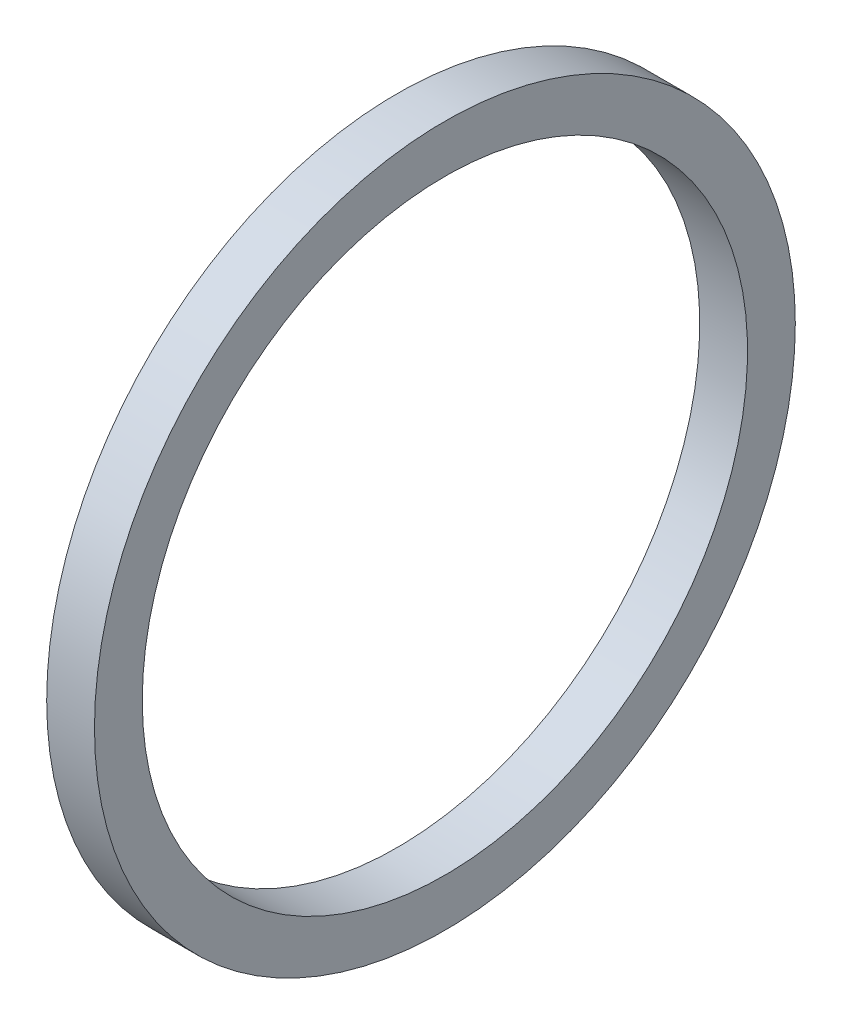
ISO-10303-21;
HEADER;
FILE_DESCRIPTION(('STEP AP214'),'2;1');
FILE_NAME('part.step','',(''),(''),'','','');
FILE_SCHEMA(('AUTOMOTIVE_DESIGN { 1 0 10303 214 1 1 1 1 }'));
ENDSEC;
DATA;
#1=APPLICATION_CONTEXT('core data for automotive mechanical design processes');
#2=APPLICATION_PROTOCOL_DEFINITION('international standard','automotive_design',2000,#1);
#3=PRODUCT_CONTEXT('',#1,'mechanical');
#4=PRODUCT('Part','Part','',(#3));
#5=PRODUCT_RELATED_PRODUCT_CATEGORY('part','',(#4));
#6=PRODUCT_DEFINITION_FORMATION('','',#4);
#7=PRODUCT_DEFINITION_CONTEXT('part definition',#1,'design');
#8=PRODUCT_DEFINITION('design','',#6,#7);
#9=PRODUCT_DEFINITION_SHAPE('','',#8);
#10=(LENGTH_UNIT() NAMED_UNIT(*) SI_UNIT(.MILLI.,.METRE.));
#11=(NAMED_UNIT(*) PLANE_ANGLE_UNIT() SI_UNIT($,.RADIAN.));
#12=(NAMED_UNIT(*) SI_UNIT($,.STERADIAN.) SOLID_ANGLE_UNIT());
#13=UNCERTAINTY_MEASURE_WITH_UNIT(LENGTH_MEASURE(1.E-05),#10,'distance_accuracy_value','');
#14=(GEOMETRIC_REPRESENTATION_CONTEXT(3) GLOBAL_UNCERTAINTY_ASSIGNED_CONTEXT((#13)) GLOBAL_UNIT_ASSIGNED_CONTEXT((#10,
#11,#12)) REPRESENTATION_CONTEXT('',''));
#15=CARTESIAN_POINT('',(0.,0.,0.));
#16=DIRECTION('',(0.,0.,1.));
#17=DIRECTION('',(1.,0.,0.));
#18=AXIS2_PLACEMENT_3D('',#15,#16,#17);
#19=CARTESIAN_POINT('',(-1.5,0.,-19.));
#20=DIRECTION('',(1.,0.,0.));
#21=DIRECTION('',(0.,0.,-1.));
#22=AXIS2_PLACEMENT_3D('',#19,#20,#21);
#23=PLANE('',#22);
#24=CARTESIAN_POINT('',(-1.5,0.,0.));
#25=DIRECTION('',(-1.,0.,0.));
#26=DIRECTION('',(0.,0.,1.));
#27=AXIS2_PLACEMENT_3D('',#24,#25,#26);
#28=CIRCLE('',#27,19.);
#29=CARTESIAN_POINT('',(-1.5,0.,19.));
#30=VERTEX_POINT('',#29);
#31=EDGE_CURVE('E10',#30,#30,#28,.T.);
#32=ORIENTED_EDGE('',*,*,#31,.F.);
#33=EDGE_LOOP('',(#32));
#34=FACE_BOUND('',#33,.T.);
#35=CARTESIAN_POINT('',(-1.5,0.,0.));
#36=DIRECTION('',(-1.,0.,0.));
#37=DIRECTION('',(0.,0.,1.));
#38=AXIS2_PLACEMENT_3D('',#35,#36,#37);
#39=CIRCLE('',#38,22.);
#40=CARTESIAN_POINT('',(-1.5,0.,22.));
#41=VERTEX_POINT('',#40);
#42=EDGE_CURVE('E54',#41,#41,#39,.T.);
#43=ORIENTED_EDGE('',*,*,#42,.T.);
#44=EDGE_LOOP('',(#43));
#45=FACE_BOUND('',#44,.T.);
#46=ADVANCED_FACE('F37',(#34,#45),#23,.F.);
#47=CARTESIAN_POINT('',(0.,0.,0.));
#48=DIRECTION('',(-1.,0.,0.));
#49=DIRECTION('',(0.,0.,1.));
#50=AXIS2_PLACEMENT_3D('',#47,#48,#49);
#51=CYLINDRICAL_SURFACE('',#50,19.);
#52=CARTESIAN_POINT('',(1.5,0.,0.));
#53=DIRECTION('',(-1.,0.,0.));
#54=DIRECTION('',(0.,0.,1.));
#55=AXIS2_PLACEMENT_3D('',#52,#53,#54);
#56=CIRCLE('',#55,19.);
#57=CARTESIAN_POINT('',(1.5,0.,19.));
#58=VERTEX_POINT('',#57);
#59=EDGE_CURVE('E44',#58,#58,#56,.T.);
#60=ORIENTED_EDGE('',*,*,#59,.F.);
#61=EDGE_LOOP('',(#60));
#62=FACE_BOUND('',#61,.T.);
#63=ORIENTED_EDGE('',*,*,#31,.T.);
#64=EDGE_LOOP('',(#63));
#65=FACE_BOUND('',#64,.T.);
#66=ADVANCED_FACE('F70',(#62,#65),#51,.F.);
#67=CARTESIAN_POINT('',(1.5,0.,-19.));
#68=DIRECTION('',(-1.,0.,0.));
#69=DIRECTION('',(0.,0.,1.));
#70=AXIS2_PLACEMENT_3D('',#67,#68,#69);
#71=PLANE('',#70);
#72=CARTESIAN_POINT('',(1.5,0.,0.));
#73=DIRECTION('',(-1.,0.,0.));
#74=DIRECTION('',(0.,0.,1.));
#75=AXIS2_PLACEMENT_3D('',#72,#73,#74);
#76=CIRCLE('',#75,22.);
#77=CARTESIAN_POINT('',(1.5,0.,22.));
#78=VERTEX_POINT('',#77);
#79=EDGE_CURVE('E49',#78,#78,#76,.T.);
#80=ORIENTED_EDGE('',*,*,#79,.F.);
#81=EDGE_LOOP('',(#80));
#82=FACE_BOUND('',#81,.T.);
#83=ORIENTED_EDGE('',*,*,#59,.T.);
#84=EDGE_LOOP('',(#83));
#85=FACE_BOUND('',#84,.T.);
#86=ADVANCED_FACE('F65',(#82,#85),#71,.F.);
#87=CARTESIAN_POINT('',(0.,0.,0.));
#88=DIRECTION('',(-1.,0.,0.));
#89=DIRECTION('',(0.,0.,1.));
#90=AXIS2_PLACEMENT_3D('',#87,#88,#89);
#91=CYLINDRICAL_SURFACE('',#90,22.);
#92=ORIENTED_EDGE('',*,*,#42,.F.);
#93=EDGE_LOOP('',(#92));
#94=FACE_BOUND('',#93,.T.);
#95=ORIENTED_EDGE('',*,*,#79,.T.);
#96=EDGE_LOOP('',(#95));
#97=FACE_BOUND('',#96,.T.);
#98=ADVANCED_FACE('F62',(#94,#97),#91,.T.);
#99=CLOSED_SHELL('',(#46,#66,#86,#98));
#100=MANIFOLD_SOLID_BREP('B2',#99);
#101=ADVANCED_BREP_SHAPE_REPRESENTATION('',(#18,#100),#14);
#102=SHAPE_DEFINITION_REPRESENTATION(#9,#101);
ENDSEC;
END-ISO-10303-21;
